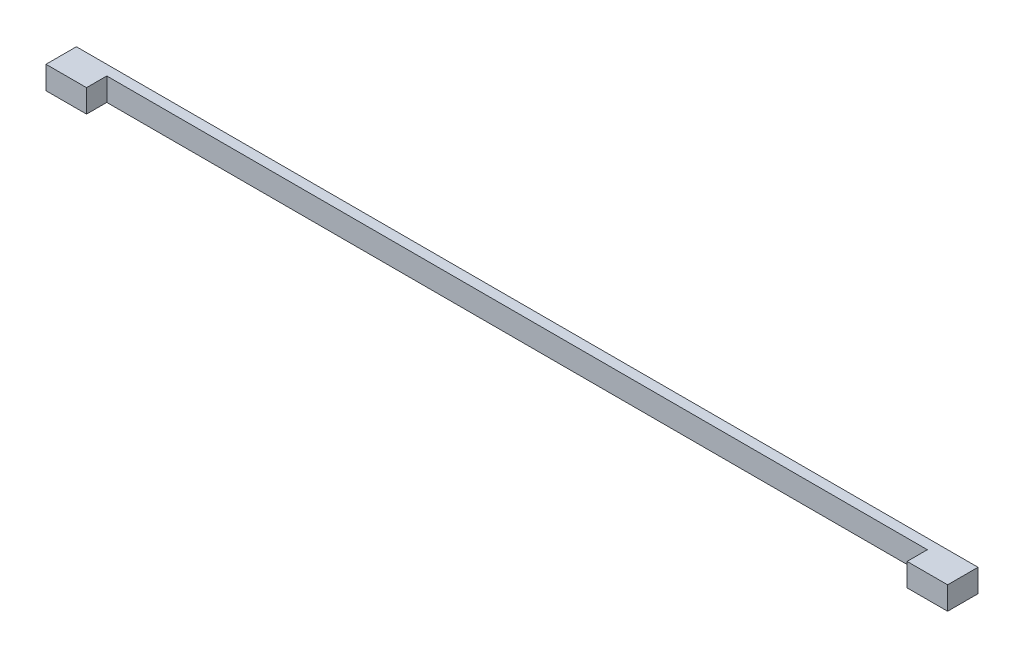
ISO-10303-21;
HEADER;
FILE_DESCRIPTION(('STEP AP214'),'2;1');
FILE_NAME('part.step','',(''),(''),'','','');
FILE_SCHEMA(('AUTOMOTIVE_DESIGN { 1 0 10303 214 1 1 1 1 }'));
ENDSEC;
DATA;
#1=APPLICATION_CONTEXT('core data for automotive mechanical design processes');
#2=APPLICATION_PROTOCOL_DEFINITION('international standard','automotive_design',2000,#1);
#3=PRODUCT_CONTEXT('',#1,'mechanical');
#4=PRODUCT('Part','Part','',(#3));
#5=PRODUCT_RELATED_PRODUCT_CATEGORY('part','',(#4));
#6=PRODUCT_DEFINITION_FORMATION('','',#4);
#7=PRODUCT_DEFINITION_CONTEXT('part definition',#1,'design');
#8=PRODUCT_DEFINITION('design','',#6,#7);
#9=PRODUCT_DEFINITION_SHAPE('','',#8);
#10=(LENGTH_UNIT() NAMED_UNIT(*) SI_UNIT(.MILLI.,.METRE.));
#11=(NAMED_UNIT(*) PLANE_ANGLE_UNIT() SI_UNIT($,.RADIAN.));
#12=(NAMED_UNIT(*) SI_UNIT($,.STERADIAN.) SOLID_ANGLE_UNIT());
#13=UNCERTAINTY_MEASURE_WITH_UNIT(LENGTH_MEASURE(1.E-05),#10,'distance_accuracy_value','');
#14=(GEOMETRIC_REPRESENTATION_CONTEXT(3) GLOBAL_UNCERTAINTY_ASSIGNED_CONTEXT((#13)) GLOBAL_UNIT_ASSIGNED_CONTEXT((#10,
#11,#12)) REPRESENTATION_CONTEXT('',''));
#15=CARTESIAN_POINT('',(0.,0.,0.));
#16=DIRECTION('',(0.,0.,1.));
#17=DIRECTION('',(1.,0.,0.));
#18=AXIS2_PLACEMENT_3D('',#15,#16,#17);
#19=CARTESIAN_POINT('',(0.,0.,5.));
#20=DIRECTION('',(0.,0.,1.));
#21=DIRECTION('',(1.,0.,0.));
#22=AXIS2_PLACEMENT_3D('',#19,#20,#21);
#23=PLANE('',#22);
#24=DIRECTION('',(1.,0.,0.));
#25=VECTOR('',#24,1.);
#26=CARTESIAN_POINT('',(-222.5,-5.66011176625891,5.));
#27=LINE('',#26,#25);
#28=CARTESIAN_POINT('',(-202.5,-5.66011176625891,5.));
#29=VERTEX_POINT('',#28);
#30=CARTESIAN_POINT('',(202.5,-5.66011176625891,5.));
#31=VERTEX_POINT('',#30);
#32=EDGE_CURVE('E64',#29,#31,#27,.T.);
#33=ORIENTED_EDGE('',*,*,#32,.T.);
#34=DIRECTION('',(0.,-1.,0.));
#35=VECTOR('',#34,1.);
#36=CARTESIAN_POINT('',(202.5,5.66011176625891,5.));
#37=LINE('',#36,#35);
#38=CARTESIAN_POINT('',(202.5,5.66011176625891,5.));
#39=VERTEX_POINT('',#38);
#40=EDGE_CURVE('E59',#39,#31,#37,.T.);
#41=ORIENTED_EDGE('',*,*,#40,.F.);
#42=DIRECTION('',(-1.,0.,0.));
#43=VECTOR('',#42,1.);
#44=CARTESIAN_POINT('',(-222.5,5.66011176625891,5.));
#45=LINE('',#44,#43);
#46=CARTESIAN_POINT('',(-202.5,5.66011176625891,5.));
#47=VERTEX_POINT('',#46);
#48=EDGE_CURVE('E169',#39,#47,#45,.T.);
#49=ORIENTED_EDGE('',*,*,#48,.T.);
#50=DIRECTION('',(0.,1.,0.));
#51=VECTOR('',#50,1.);
#52=CARTESIAN_POINT('',(-202.5,-5.66011176625891,5.));
#53=LINE('',#52,#51);
#54=EDGE_CURVE('E138',#29,#47,#53,.T.);
#55=ORIENTED_EDGE('',*,*,#54,.F.);
#56=EDGE_LOOP('',(#33,#41,#49,#55));
#57=FACE_BOUND('',#56,.T.);
#58=ADVANCED_FACE('F43',(#57),#23,.T.);
#59=CARTESIAN_POINT('',(222.5,5.66011176625891,5.));
#60=DIRECTION('',(-1.,0.,0.));
#61=DIRECTION('',(0.,0.,1.));
#62=AXIS2_PLACEMENT_3D('',#59,#60,#61);
#63=PLANE('',#62);
#64=DIRECTION('',(0.,1.,0.));
#65=VECTOR('',#64,1.);
#66=CARTESIAN_POINT('',(222.5,5.66011176625891,0.));
#67=LINE('',#66,#65);
#68=CARTESIAN_POINT('',(222.5,-5.66011176625891,0.));
#69=VERTEX_POINT('',#68);
#70=CARTESIAN_POINT('',(222.5,5.66011176625891,0.));
#71=VERTEX_POINT('',#70);
#72=EDGE_CURVE('E168',#69,#71,#67,.T.);
#73=ORIENTED_EDGE('',*,*,#72,.T.);
#74=DIRECTION('',(0.,0.,-1.));
#75=VECTOR('',#74,1.);
#76=CARTESIAN_POINT('',(222.5,5.66011176625891,5.));
#77=LINE('',#76,#75);
#78=CARTESIAN_POINT('',(222.5,5.66011176625891,15.));
#79=VERTEX_POINT('',#78);
#80=EDGE_CURVE('E11',#79,#71,#77,.T.);
#81=ORIENTED_EDGE('',*,*,#80,.F.);
#82=DIRECTION('',(0.,1.,0.));
#83=VECTOR('',#82,1.);
#84=CARTESIAN_POINT('',(222.5,5.66011176625891,15.));
#85=LINE('',#84,#83);
#86=CARTESIAN_POINT('',(222.5,-5.66011176625891,15.));
#87=VERTEX_POINT('',#86);
#88=EDGE_CURVE('E125',#87,#79,#85,.T.);
#89=ORIENTED_EDGE('',*,*,#88,.F.);
#90=DIRECTION('',(0.,0.,-1.));
#91=VECTOR('',#90,1.);
#92=CARTESIAN_POINT('',(222.5,-5.66011176625891,5.));
#93=LINE('',#92,#91);
#94=EDGE_CURVE('E107',#87,#69,#93,.T.);
#95=ORIENTED_EDGE('',*,*,#94,.T.);
#96=EDGE_LOOP('',(#73,#81,#89,#95));
#97=FACE_BOUND('',#96,.T.);
#98=ADVANCED_FACE('F45',(#97),#63,.F.);
#99=CARTESIAN_POINT('',(-222.5,5.66011176625891,5.));
#100=DIRECTION('',(0.,-1.,0.));
#101=DIRECTION('',(0.,0.,-1.));
#102=AXIS2_PLACEMENT_3D('',#99,#100,#101);
#103=PLANE('',#102);
#104=DIRECTION('',(-1.,0.,0.));
#105=VECTOR('',#104,1.);
#106=CARTESIAN_POINT('',(-222.5,5.66011176625891,0.));
#107=LINE('',#106,#105);
#108=CARTESIAN_POINT('',(-222.5,5.66011176625891,0.));
#109=VERTEX_POINT('',#108);
#110=EDGE_CURVE('E176',#71,#109,#107,.T.);
#111=ORIENTED_EDGE('',*,*,#110,.T.);
#112=DIRECTION('',(0.,0.,-1.));
#113=VECTOR('',#112,1.);
#114=CARTESIAN_POINT('',(-222.5,5.66011176625891,5.));
#115=LINE('',#114,#113);
#116=CARTESIAN_POINT('',(-222.5,5.66011176625891,15.));
#117=VERTEX_POINT('',#116);
#118=EDGE_CURVE('E52',#117,#109,#115,.T.);
#119=ORIENTED_EDGE('',*,*,#118,.F.);
#120=DIRECTION('',(-1.,0.,0.));
#121=VECTOR('',#120,1.);
#122=CARTESIAN_POINT('',(-222.5,5.66011176625891,15.));
#123=LINE('',#122,#121);
#124=CARTESIAN_POINT('',(-202.5,5.66011176625891,15.));
#125=VERTEX_POINT('',#124);
#126=EDGE_CURVE('E153',#125,#117,#123,.T.);
#127=ORIENTED_EDGE('',*,*,#126,.F.);
#128=DIRECTION('',(0.,0.,-1.));
#129=VECTOR('',#128,1.);
#130=CARTESIAN_POINT('',(-202.5,5.66011176625891,15.));
#131=LINE('',#130,#129);
#132=EDGE_CURVE('E157',#125,#47,#131,.T.);
#133=ORIENTED_EDGE('',*,*,#132,.T.);
#134=ORIENTED_EDGE('',*,*,#48,.F.);
#135=DIRECTION('',(0.,0.,-1.));
#136=VECTOR('',#135,1.);
#137=CARTESIAN_POINT('',(202.5,5.66011176625891,15.));
#138=LINE('',#137,#136);
#139=CARTESIAN_POINT('',(202.5,5.66011176625891,15.));
#140=VERTEX_POINT('',#139);
#141=EDGE_CURVE('E198',#140,#39,#138,.T.);
#142=ORIENTED_EDGE('',*,*,#141,.F.);
#143=DIRECTION('',(-1.,0.,0.));
#144=VECTOR('',#143,1.);
#145=CARTESIAN_POINT('',(222.5,5.66011176625891,15.));
#146=LINE('',#145,#144);
#147=EDGE_CURVE('E134',#79,#140,#146,.T.);
#148=ORIENTED_EDGE('',*,*,#147,.F.);
#149=ORIENTED_EDGE('',*,*,#80,.T.);
#150=EDGE_LOOP('',(#111,#119,#127,#133,#134,#142,#148,#149));
#151=FACE_BOUND('',#150,.T.);
#152=ADVANCED_FACE('F195',(#151),#103,.F.);
#153=CARTESIAN_POINT('',(-222.5,5.66011176625891,5.));
#154=DIRECTION('',(1.,0.,0.));
#155=DIRECTION('',(0.,0.,-1.));
#156=AXIS2_PLACEMENT_3D('',#153,#154,#155);
#157=PLANE('',#156);
#158=DIRECTION('',(0.,-1.,0.));
#159=VECTOR('',#158,1.);
#160=CARTESIAN_POINT('',(-222.5,5.66011176625891,0.));
#161=LINE('',#160,#159);
#162=CARTESIAN_POINT('',(-222.5,-5.66011176625891,0.));
#163=VERTEX_POINT('',#162);
#164=EDGE_CURVE('E179',#109,#163,#161,.T.);
#165=ORIENTED_EDGE('',*,*,#164,.T.);
#166=DIRECTION('',(0.,0.,-1.));
#167=VECTOR('',#166,1.);
#168=CARTESIAN_POINT('',(-222.5,-5.66011176625891,5.));
#169=LINE('',#168,#167);
#170=CARTESIAN_POINT('',(-222.5,-5.66011176625891,15.));
#171=VERTEX_POINT('',#170);
#172=EDGE_CURVE('E120',#171,#163,#169,.T.);
#173=ORIENTED_EDGE('',*,*,#172,.F.);
#174=DIRECTION('',(0.,-1.,0.));
#175=VECTOR('',#174,1.);
#176=CARTESIAN_POINT('',(-222.5,-5.66011176625891,15.));
#177=LINE('',#176,#175);
#178=EDGE_CURVE('E143',#117,#171,#177,.T.);
#179=ORIENTED_EDGE('',*,*,#178,.F.);
#180=ORIENTED_EDGE('',*,*,#118,.T.);
#181=EDGE_LOOP('',(#165,#173,#179,#180));
#182=FACE_BOUND('',#181,.T.);
#183=ADVANCED_FACE('F190',(#182),#157,.F.);
#184=CARTESIAN_POINT('',(-222.5,-5.66011176625891,5.));
#185=DIRECTION('',(0.,1.,0.));
#186=DIRECTION('',(0.,0.,1.));
#187=AXIS2_PLACEMENT_3D('',#184,#185,#186);
#188=PLANE('',#187);
#189=DIRECTION('',(1.,0.,0.));
#190=VECTOR('',#189,1.);
#191=CARTESIAN_POINT('',(-222.5,-5.66011176625891,0.));
#192=LINE('',#191,#190);
#193=EDGE_CURVE('E114',#163,#69,#192,.T.);
#194=ORIENTED_EDGE('',*,*,#193,.T.);
#195=ORIENTED_EDGE('',*,*,#94,.F.);
#196=DIRECTION('',(1.,0.,0.));
#197=VECTOR('',#196,1.);
#198=CARTESIAN_POINT('',(222.5,-5.66011176625891,15.));
#199=LINE('',#198,#197);
#200=CARTESIAN_POINT('',(202.5,-5.66011176625891,15.));
#201=VERTEX_POINT('',#200);
#202=EDGE_CURVE('E111',#201,#87,#199,.T.);
#203=ORIENTED_EDGE('',*,*,#202,.F.);
#204=DIRECTION('',(0.,0.,-1.));
#205=VECTOR('',#204,1.);
#206=CARTESIAN_POINT('',(202.5,-5.66011176625891,15.));
#207=LINE('',#206,#205);
#208=EDGE_CURVE('E130',#201,#31,#207,.T.);
#209=ORIENTED_EDGE('',*,*,#208,.T.);
#210=ORIENTED_EDGE('',*,*,#32,.F.);
#211=DIRECTION('',(0.,0.,-1.));
#212=VECTOR('',#211,1.);
#213=CARTESIAN_POINT('',(-202.5,-5.66011176625891,15.));
#214=LINE('',#213,#212);
#215=CARTESIAN_POINT('',(-202.5,-5.66011176625891,15.));
#216=VERTEX_POINT('',#215);
#217=EDGE_CURVE('E164',#216,#29,#214,.T.);
#218=ORIENTED_EDGE('',*,*,#217,.F.);
#219=DIRECTION('',(1.,0.,0.));
#220=VECTOR('',#219,1.);
#221=CARTESIAN_POINT('',(-222.5,-5.66011176625891,15.));
#222=LINE('',#221,#220);
#223=EDGE_CURVE('E147',#171,#216,#222,.T.);
#224=ORIENTED_EDGE('',*,*,#223,.F.);
#225=ORIENTED_EDGE('',*,*,#172,.T.);
#226=EDGE_LOOP('',(#194,#195,#203,#209,#210,#218,#224,#225));
#227=FACE_BOUND('',#226,.T.);
#228=ADVANCED_FACE('F109',(#227),#188,.F.);
#229=CARTESIAN_POINT('',(0.,0.,0.));
#230=DIRECTION('',(0.,0.,1.));
#231=DIRECTION('',(1.,0.,0.));
#232=AXIS2_PLACEMENT_3D('',#229,#230,#231);
#233=PLANE('',#232);
#234=ORIENTED_EDGE('',*,*,#72,.F.);
#235=ORIENTED_EDGE('',*,*,#193,.F.);
#236=ORIENTED_EDGE('',*,*,#164,.F.);
#237=ORIENTED_EDGE('',*,*,#110,.F.);
#238=EDGE_LOOP('',(#234,#235,#236,#237));
#239=FACE_BOUND('',#238,.T.);
#240=ADVANCED_FACE('F194',(#239),#233,.F.);
#241=CARTESIAN_POINT('',(-202.5,-5.66011176625891,15.));
#242=DIRECTION('',(-1.,0.,0.));
#243=DIRECTION('',(0.,0.,1.));
#244=AXIS2_PLACEMENT_3D('',#241,#242,#243);
#245=PLANE('',#244);
#246=ORIENTED_EDGE('',*,*,#54,.T.);
#247=ORIENTED_EDGE('',*,*,#132,.F.);
#248=DIRECTION('',(0.,1.,0.));
#249=VECTOR('',#248,1.);
#250=CARTESIAN_POINT('',(-202.5,-5.66011176625891,15.));
#251=LINE('',#250,#249);
#252=EDGE_CURVE('E150',#216,#125,#251,.T.);
#253=ORIENTED_EDGE('',*,*,#252,.F.);
#254=ORIENTED_EDGE('',*,*,#217,.T.);
#255=EDGE_LOOP('',(#246,#247,#253,#254));
#256=FACE_BOUND('',#255,.T.);
#257=ADVANCED_FACE('F210',(#256),#245,.F.);
#258=CARTESIAN_POINT('',(0.,0.,15.));
#259=DIRECTION('',(0.,0.,-1.));
#260=DIRECTION('',(-1.,0.,0.));
#261=AXIS2_PLACEMENT_3D('',#258,#259,#260);
#262=PLANE('',#261);
#263=ORIENTED_EDGE('',*,*,#178,.T.);
#264=ORIENTED_EDGE('',*,*,#223,.T.);
#265=ORIENTED_EDGE('',*,*,#252,.T.);
#266=ORIENTED_EDGE('',*,*,#126,.T.);
#267=EDGE_LOOP('',(#263,#264,#265,#266));
#268=FACE_BOUND('',#267,.T.);
#269=ADVANCED_FACE('F213',(#268),#262,.F.);
#270=CARTESIAN_POINT('',(202.5,5.66011176625891,15.));
#271=DIRECTION('',(1.,0.,0.));
#272=DIRECTION('',(0.,1.,0.));
#273=AXIS2_PLACEMENT_3D('',#270,#271,#272);
#274=PLANE('',#273);
#275=ORIENTED_EDGE('',*,*,#40,.T.);
#276=ORIENTED_EDGE('',*,*,#208,.F.);
#277=DIRECTION('',(0.,-1.,0.));
#278=VECTOR('',#277,1.);
#279=CARTESIAN_POINT('',(202.5,5.66011176625891,15.));
#280=LINE('',#279,#278);
#281=EDGE_CURVE('E127',#140,#201,#280,.T.);
#282=ORIENTED_EDGE('',*,*,#281,.F.);
#283=ORIENTED_EDGE('',*,*,#141,.T.);
#284=EDGE_LOOP('',(#275,#276,#282,#283));
#285=FACE_BOUND('',#284,.T.);
#286=ADVANCED_FACE('F202',(#285),#274,.F.);
#287=CARTESIAN_POINT('',(0.,0.,15.));
#288=DIRECTION('',(0.,0.,-1.));
#289=DIRECTION('',(-1.,0.,0.));
#290=AXIS2_PLACEMENT_3D('',#287,#288,#289);
#291=PLANE('',#290);
#292=ORIENTED_EDGE('',*,*,#88,.T.);
#293=ORIENTED_EDGE('',*,*,#147,.T.);
#294=ORIENTED_EDGE('',*,*,#281,.T.);
#295=ORIENTED_EDGE('',*,*,#202,.T.);
#296=EDGE_LOOP('',(#292,#293,#294,#295));
#297=FACE_BOUND('',#296,.T.);
#298=ADVANCED_FACE('F124',(#297),#291,.F.);
#299=CLOSED_SHELL('',(#58,#98,#152,#183,#228,#240,#257,#269,#286,#298));
#300=MANIFOLD_SOLID_BREP('B2',#299);
#301=ADVANCED_BREP_SHAPE_REPRESENTATION('',(#18,#300),#14);
#302=SHAPE_DEFINITION_REPRESENTATION(#9,#301);
ENDSEC;
END-ISO-10303-21;
